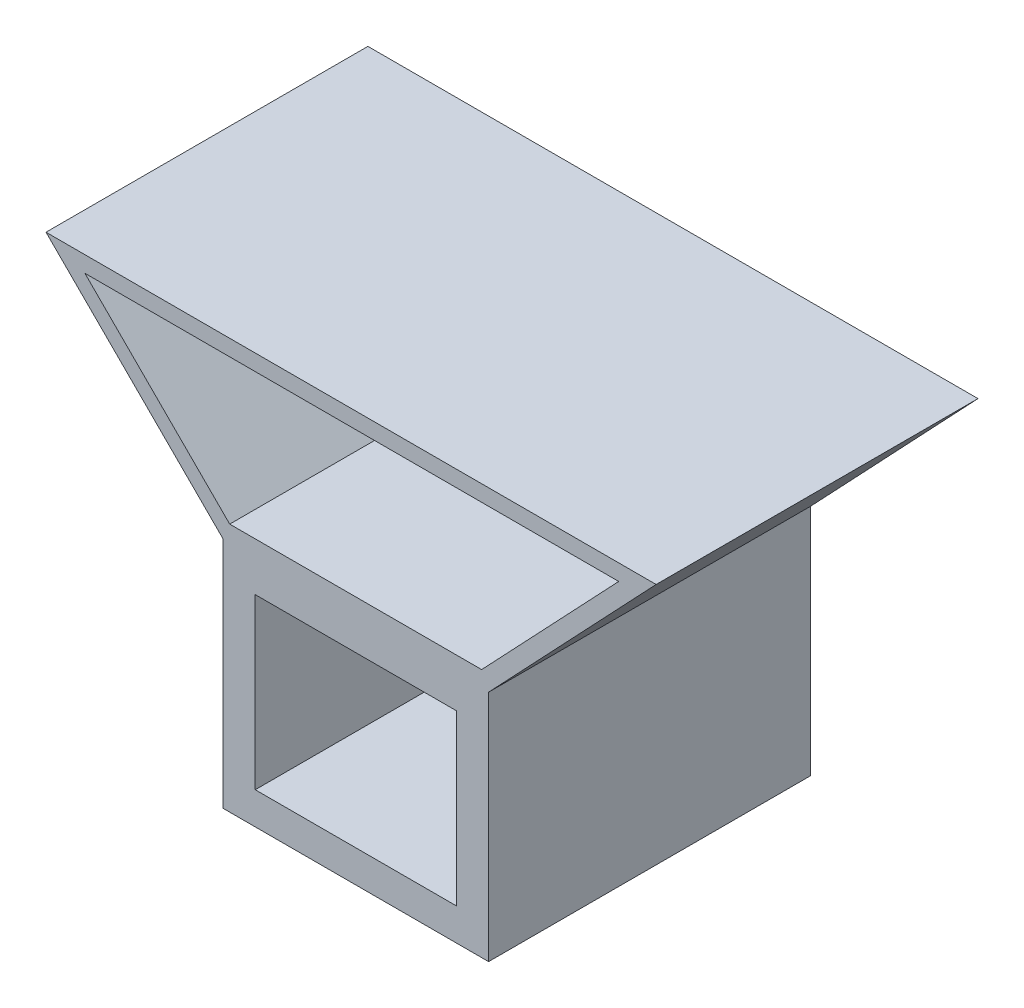
ISO-10303-21;
HEADER;
FILE_DESCRIPTION(('STEP AP214'),'2;1');
FILE_NAME('part.step','',(''),(''),'','','');
FILE_SCHEMA(('AUTOMOTIVE_DESIGN { 1 0 10303 214 1 1 1 1 }'));
ENDSEC;
DATA;
#1=APPLICATION_CONTEXT('core data for automotive mechanical design processes');
#2=APPLICATION_PROTOCOL_DEFINITION('international standard','automotive_design',2000,#1);
#3=PRODUCT_CONTEXT('',#1,'mechanical');
#4=PRODUCT('Part','Part','',(#3));
#5=PRODUCT_RELATED_PRODUCT_CATEGORY('part','',(#4));
#6=PRODUCT_DEFINITION_FORMATION('','',#4);
#7=PRODUCT_DEFINITION_CONTEXT('part definition',#1,'design');
#8=PRODUCT_DEFINITION('design','',#6,#7);
#9=PRODUCT_DEFINITION_SHAPE('','',#8);
#10=(LENGTH_UNIT() NAMED_UNIT(*) SI_UNIT(.MILLI.,.METRE.));
#11=(NAMED_UNIT(*) PLANE_ANGLE_UNIT() SI_UNIT($,.RADIAN.));
#12=(NAMED_UNIT(*) SI_UNIT($,.STERADIAN.) SOLID_ANGLE_UNIT());
#13=UNCERTAINTY_MEASURE_WITH_UNIT(LENGTH_MEASURE(1.E-05),#10,'distance_accuracy_value','');
#14=(GEOMETRIC_REPRESENTATION_CONTEXT(3) GLOBAL_UNCERTAINTY_ASSIGNED_CONTEXT((#13)) GLOBAL_UNIT_ASSIGNED_CONTEXT((#10,
#11,#12)) REPRESENTATION_CONTEXT('',''));
#15=CARTESIAN_POINT('',(0.,0.,0.));
#16=DIRECTION('',(0.,0.,1.));
#17=DIRECTION('',(1.,0.,0.));
#18=AXIS2_PLACEMENT_3D('',#15,#16,#17);
#19=CARTESIAN_POINT('',(0.,0.,20.));
#20=DIRECTION('',(0.,0.,1.));
#21=DIRECTION('',(1.,0.,0.));
#22=AXIS2_PLACEMENT_3D('',#19,#20,#21);
#23=PLANE('',#22);
#24=DIRECTION('',(1.,0.,0.));
#25=VECTOR('',#24,1.);
#26=CARTESIAN_POINT('',(-2.,-2.,20.));
#27=LINE('',#26,#25);
#28=CARTESIAN_POINT('',(-2.,-2.,20.));
#29=VERTEX_POINT('',#28);
#30=CARTESIAN_POINT('',(14.5,-2.,20.));
#31=VERTEX_POINT('',#30);
#32=EDGE_CURVE('E264',#29,#31,#27,.T.);
#33=ORIENTED_EDGE('',*,*,#32,.T.);
#34=DIRECTION('',(0.,1.,0.));
#35=VECTOR('',#34,1.);
#36=CARTESIAN_POINT('',(14.5,-2.,20.));
#37=LINE('',#36,#35);
#38=CARTESIAN_POINT('',(14.5,12.5,20.));
#39=VERTEX_POINT('',#38);
#40=EDGE_CURVE('E268',#31,#39,#37,.T.);
#41=ORIENTED_EDGE('',*,*,#40,.T.);
#42=DIRECTION('',(-0.687287569698679,-0.726385432492753,0.));
#43=VECTOR('',#42,1.);
#44=CARTESIAN_POINT('',(24.9079224727031,23.5,20.));
#45=LINE('',#44,#43);
#46=CARTESIAN_POINT('',(24.9079224727031,23.5,20.));
#47=VERTEX_POINT('',#46);
#48=EDGE_CURVE('E206',#47,#39,#45,.T.);
#49=ORIENTED_EDGE('',*,*,#48,.F.);
#50=DIRECTION('',(1.,0.,0.));
#51=VECTOR('',#50,1.);
#52=CARTESIAN_POINT('',(24.9079224727031,23.5,20.));
#53=LINE('',#52,#51);
#54=CARTESIAN_POINT('',(-13.,23.5,20.));
#55=VERTEX_POINT('',#54);
#56=EDGE_CURVE('E201',#55,#47,#53,.T.);
#57=ORIENTED_EDGE('',*,*,#56,.F.);
#58=DIRECTION('',(-0.707106781186549,0.707106781186546,0.));
#59=VECTOR('',#58,1.);
#60=CARTESIAN_POINT('',(-2.,12.5,20.));
#61=LINE('',#60,#59);
#62=CARTESIAN_POINT('',(-2.,12.5,20.));
#63=VERTEX_POINT('',#62);
#64=EDGE_CURVE('E197',#63,#55,#61,.T.);
#65=ORIENTED_EDGE('',*,*,#64,.F.);
#66=DIRECTION('',(0.,-1.,0.));
#67=VECTOR('',#66,1.);
#68=CARTESIAN_POINT('',(-2.,-2.,20.));
#69=LINE('',#68,#67);
#70=EDGE_CURVE('E272',#63,#29,#69,.T.);
#71=ORIENTED_EDGE('',*,*,#70,.T.);
#72=EDGE_LOOP('',(#33,#41,#49,#57,#65,#71));
#73=FACE_BOUND('',#72,.T.);
#74=DIRECTION('',(1.,0.,0.));
#75=VECTOR('',#74,1.);
#76=CARTESIAN_POINT('',(0.,0.,20.));
#77=LINE('',#76,#75);
#78=CARTESIAN_POINT('',(0.,0.,20.));
#79=VERTEX_POINT('',#78);
#80=CARTESIAN_POINT('',(12.5,0.,20.));
#81=VERTEX_POINT('',#80);
#82=EDGE_CURVE('E229',#79,#81,#77,.T.);
#83=ORIENTED_EDGE('',*,*,#82,.F.);
#84=DIRECTION('',(0.,-1.,0.));
#85=VECTOR('',#84,1.);
#86=CARTESIAN_POINT('',(0.,0.,20.));
#87=LINE('',#86,#85);
#88=CARTESIAN_POINT('',(0.,10.5,20.));
#89=VERTEX_POINT('',#88);
#90=EDGE_CURVE('E226',#89,#79,#87,.T.);
#91=ORIENTED_EDGE('',*,*,#90,.F.);
#92=DIRECTION('',(-1.,0.,0.));
#93=VECTOR('',#92,1.);
#94=CARTESIAN_POINT('',(0.,10.5,20.));
#95=LINE('',#94,#93);
#96=CARTESIAN_POINT('',(12.5,10.5,20.));
#97=VERTEX_POINT('',#96);
#98=EDGE_CURVE('E236',#97,#89,#95,.T.);
#99=ORIENTED_EDGE('',*,*,#98,.F.);
#100=DIRECTION('',(0.,1.,0.));
#101=VECTOR('',#100,1.);
#102=CARTESIAN_POINT('',(12.5,0.,20.));
#103=LINE('',#102,#101);
#104=EDGE_CURVE('E233',#81,#97,#103,.T.);
#105=ORIENTED_EDGE('',*,*,#104,.F.);
#106=EDGE_LOOP('',(#83,#91,#99,#105));
#107=FACE_BOUND('',#106,.T.);
#108=DIRECTION('',(1.,0.,0.));
#109=VECTOR('',#108,1.);
#110=CARTESIAN_POINT('',(22.5850681116122,22.5,20.));
#111=LINE('',#110,#109);
#112=CARTESIAN_POINT('',(-10.5857864376269,22.5,20.));
#113=VERTEX_POINT('',#112);
#114=CARTESIAN_POINT('',(22.5850681116122,22.5,20.));
#115=VERTEX_POINT('',#114);
#116=EDGE_CURVE('E147',#113,#115,#111,.T.);
#117=ORIENTED_EDGE('',*,*,#116,.T.);
#118=DIRECTION('',(-0.687287569698679,-0.726385432492752,0.));
#119=VECTOR('',#118,1.);
#120=CARTESIAN_POINT('',(22.5850681116122,22.5,20.));
#121=LINE('',#120,#119);
#122=CARTESIAN_POINT('',(14.0694951794006,13.5,20.));
#123=VERTEX_POINT('',#122);
#124=EDGE_CURVE('E160',#115,#123,#121,.T.);
#125=ORIENTED_EDGE('',*,*,#124,.T.);
#126=DIRECTION('',(-1.,0.,0.));
#127=VECTOR('',#126,1.);
#128=CARTESIAN_POINT('',(14.0694951794006,13.5,20.));
#129=LINE('',#128,#127);
#130=CARTESIAN_POINT('',(-1.58578643762691,13.5,20.));
#131=VERTEX_POINT('',#130);
#132=EDGE_CURVE('E165',#123,#131,#129,.T.);
#133=ORIENTED_EDGE('',*,*,#132,.T.);
#134=DIRECTION('',(-0.707106781186548,0.707106781186547,0.));
#135=VECTOR('',#134,1.);
#136=CARTESIAN_POINT('',(-1.58578643762691,13.5,20.));
#137=LINE('',#136,#135);
#138=EDGE_CURVE('E156',#131,#113,#137,.T.);
#139=ORIENTED_EDGE('',*,*,#138,.T.);
#140=EDGE_LOOP('',(#117,#125,#133,#139));
#141=FACE_BOUND('',#140,.T.);
#142=ADVANCED_FACE('F39',(#73,#107,#141),#23,.T.);
#143=CARTESIAN_POINT('',(0.,0.,0.));
#144=DIRECTION('',(0.,0.,1.));
#145=DIRECTION('',(1.,0.,0.));
#146=AXIS2_PLACEMENT_3D('',#143,#144,#145);
#147=PLANE('',#146);
#148=DIRECTION('',(1.,0.,0.));
#149=VECTOR('',#148,1.);
#150=CARTESIAN_POINT('',(-2.,-2.,0.));
#151=LINE('',#150,#149);
#152=CARTESIAN_POINT('',(-2.,-2.,0.));
#153=VERTEX_POINT('',#152);
#154=CARTESIAN_POINT('',(14.5,-2.,0.));
#155=VERTEX_POINT('',#154);
#156=EDGE_CURVE('E263',#153,#155,#151,.T.);
#157=ORIENTED_EDGE('',*,*,#156,.F.);
#158=DIRECTION('',(0.,-1.,0.));
#159=VECTOR('',#158,1.);
#160=CARTESIAN_POINT('',(-2.,-2.,0.));
#161=LINE('',#160,#159);
#162=CARTESIAN_POINT('',(-2.,12.5,0.));
#163=VERTEX_POINT('',#162);
#164=EDGE_CURVE('E269',#163,#153,#161,.T.);
#165=ORIENTED_EDGE('',*,*,#164,.F.);
#166=DIRECTION('',(-0.707106781186549,0.707106781186546,0.));
#167=VECTOR('',#166,1.);
#168=CARTESIAN_POINT('',(-2.,12.5,0.));
#169=LINE('',#168,#167);
#170=CARTESIAN_POINT('',(-13.,23.5,0.));
#171=VERTEX_POINT('',#170);
#172=EDGE_CURVE('E191',#163,#171,#169,.T.);
#173=ORIENTED_EDGE('',*,*,#172,.T.);
#174=DIRECTION('',(1.,0.,0.));
#175=VECTOR('',#174,1.);
#176=CARTESIAN_POINT('',(24.9079224727031,23.5,0.));
#177=LINE('',#176,#175);
#178=CARTESIAN_POINT('',(24.9079224727031,23.5,0.));
#179=VERTEX_POINT('',#178);
#180=EDGE_CURVE('E214',#171,#179,#177,.T.);
#181=ORIENTED_EDGE('',*,*,#180,.T.);
#182=DIRECTION('',(-0.687287569698679,-0.726385432492753,0.));
#183=VECTOR('',#182,1.);
#184=CARTESIAN_POINT('',(24.9079224727031,23.5,0.));
#185=LINE('',#184,#183);
#186=CARTESIAN_POINT('',(14.5,12.5,0.));
#187=VERTEX_POINT('',#186);
#188=EDGE_CURVE('E202',#179,#187,#185,.T.);
#189=ORIENTED_EDGE('',*,*,#188,.T.);
#190=DIRECTION('',(0.,1.,0.));
#191=VECTOR('',#190,1.);
#192=CARTESIAN_POINT('',(14.5,-2.,0.));
#193=LINE('',#192,#191);
#194=EDGE_CURVE('E279',#155,#187,#193,.T.);
#195=ORIENTED_EDGE('',*,*,#194,.F.);
#196=EDGE_LOOP('',(#157,#165,#173,#181,#189,#195));
#197=FACE_BOUND('',#196,.T.);
#198=DIRECTION('',(0.,-1.,0.));
#199=VECTOR('',#198,1.);
#200=CARTESIAN_POINT('',(0.,0.,0.));
#201=LINE('',#200,#199);
#202=CARTESIAN_POINT('',(0.,10.5,0.));
#203=VERTEX_POINT('',#202);
#204=CARTESIAN_POINT('',(0.,0.,0.));
#205=VERTEX_POINT('',#204);
#206=EDGE_CURVE('E63',#203,#205,#201,.T.);
#207=ORIENTED_EDGE('',*,*,#206,.T.);
#208=DIRECTION('',(1.,0.,0.));
#209=VECTOR('',#208,1.);
#210=CARTESIAN_POINT('',(0.,0.,0.));
#211=LINE('',#210,#209);
#212=CARTESIAN_POINT('',(12.5,0.,0.));
#213=VERTEX_POINT('',#212);
#214=EDGE_CURVE('E242',#205,#213,#211,.T.);
#215=ORIENTED_EDGE('',*,*,#214,.T.);
#216=DIRECTION('',(0.,1.,0.));
#217=VECTOR('',#216,1.);
#218=CARTESIAN_POINT('',(12.5,0.,0.));
#219=LINE('',#218,#217);
#220=CARTESIAN_POINT('',(12.5,10.5,0.));
#221=VERTEX_POINT('',#220);
#222=EDGE_CURVE('E246',#213,#221,#219,.T.);
#223=ORIENTED_EDGE('',*,*,#222,.T.);
#224=DIRECTION('',(-1.,0.,0.));
#225=VECTOR('',#224,1.);
#226=CARTESIAN_POINT('',(0.,10.5,0.));
#227=LINE('',#226,#225);
#228=EDGE_CURVE('E230',#221,#203,#227,.T.);
#229=ORIENTED_EDGE('',*,*,#228,.T.);
#230=EDGE_LOOP('',(#207,#215,#223,#229));
#231=FACE_BOUND('',#230,.T.);
#232=DIRECTION('',(-0.687287569698679,-0.726385432492752,0.));
#233=VECTOR('',#232,1.);
#234=CARTESIAN_POINT('',(22.5850681116122,22.5,0.));
#235=LINE('',#234,#233);
#236=CARTESIAN_POINT('',(22.5850681116122,22.5,0.));
#237=VERTEX_POINT('',#236);
#238=CARTESIAN_POINT('',(14.0694951794006,13.5,0.));
#239=VERTEX_POINT('',#238);
#240=EDGE_CURVE('E182',#237,#239,#235,.T.);
#241=ORIENTED_EDGE('',*,*,#240,.F.);
#242=DIRECTION('',(1.,0.,0.));
#243=VECTOR('',#242,1.);
#244=CARTESIAN_POINT('',(22.5850681116122,22.5,0.));
#245=LINE('',#244,#243);
#246=CARTESIAN_POINT('',(-10.5857864376269,22.5,0.));
#247=VERTEX_POINT('',#246);
#248=EDGE_CURVE('E150',#247,#237,#245,.T.);
#249=ORIENTED_EDGE('',*,*,#248,.F.);
#250=DIRECTION('',(-0.707106781186548,0.707106781186547,0.));
#251=VECTOR('',#250,1.);
#252=CARTESIAN_POINT('',(-1.58578643762691,13.5,0.));
#253=LINE('',#252,#251);
#254=CARTESIAN_POINT('',(-1.58578643762691,13.5,0.));
#255=VERTEX_POINT('',#254);
#256=EDGE_CURVE('E169',#255,#247,#253,.T.);
#257=ORIENTED_EDGE('',*,*,#256,.F.);
#258=DIRECTION('',(-1.,0.,0.));
#259=VECTOR('',#258,1.);
#260=CARTESIAN_POINT('',(14.0694951794006,13.5,0.));
#261=LINE('',#260,#259);
#262=EDGE_CURVE('E173',#239,#255,#261,.T.);
#263=ORIENTED_EDGE('',*,*,#262,.F.);
#264=EDGE_LOOP('',(#241,#249,#257,#263));
#265=FACE_BOUND('',#264,.T.);
#266=ADVANCED_FACE('F299',(#197,#231,#265),#147,.F.);
#267=CARTESIAN_POINT('',(-2.,-2.,20.));
#268=DIRECTION('',(0.,1.,0.));
#269=DIRECTION('',(0.,0.,1.));
#270=AXIS2_PLACEMENT_3D('',#267,#268,#269);
#271=PLANE('',#270);
#272=ORIENTED_EDGE('',*,*,#156,.T.);
#273=DIRECTION('',(0.,0.,-1.));
#274=VECTOR('',#273,1.);
#275=CARTESIAN_POINT('',(14.5,-2.,20.));
#276=LINE('',#275,#274);
#277=EDGE_CURVE('E11',#31,#155,#276,.T.);
#278=ORIENTED_EDGE('',*,*,#277,.F.);
#279=ORIENTED_EDGE('',*,*,#32,.F.);
#280=DIRECTION('',(0.,0.,-1.));
#281=VECTOR('',#280,1.);
#282=CARTESIAN_POINT('',(-2.,-2.,20.));
#283=LINE('',#282,#281);
#284=EDGE_CURVE('E275',#29,#153,#283,.T.);
#285=ORIENTED_EDGE('',*,*,#284,.T.);
#286=EDGE_LOOP('',(#272,#278,#279,#285));
#287=FACE_BOUND('',#286,.T.);
#288=ADVANCED_FACE('F41',(#287),#271,.F.);
#289=CARTESIAN_POINT('',(14.5,-2.,20.));
#290=DIRECTION('',(-1.,0.,0.));
#291=DIRECTION('',(0.,-1.,0.));
#292=AXIS2_PLACEMENT_3D('',#289,#290,#291);
#293=PLANE('',#292);
#294=ORIENTED_EDGE('',*,*,#194,.T.);
#295=DIRECTION('',(0.,0.,-1.));
#296=VECTOR('',#295,1.);
#297=CARTESIAN_POINT('',(14.5,12.5,20.));
#298=LINE('',#297,#296);
#299=EDGE_CURVE('E48',#39,#187,#298,.T.);
#300=ORIENTED_EDGE('',*,*,#299,.F.);
#301=ORIENTED_EDGE('',*,*,#40,.F.);
#302=ORIENTED_EDGE('',*,*,#277,.T.);
#303=EDGE_LOOP('',(#294,#300,#301,#302));
#304=FACE_BOUND('',#303,.T.);
#305=ADVANCED_FACE('F312',(#304),#293,.F.);
#306=CARTESIAN_POINT('',(-2.,-2.,20.));
#307=DIRECTION('',(1.,0.,0.));
#308=DIRECTION('',(0.,1.,0.));
#309=AXIS2_PLACEMENT_3D('',#306,#307,#308);
#310=PLANE('',#309);
#311=ORIENTED_EDGE('',*,*,#164,.T.);
#312=ORIENTED_EDGE('',*,*,#284,.F.);
#313=ORIENTED_EDGE('',*,*,#70,.F.);
#314=DIRECTION('',(0.,0.,-1.));
#315=VECTOR('',#314,1.);
#316=CARTESIAN_POINT('',(-2.,12.5,20.));
#317=LINE('',#316,#315);
#318=EDGE_CURVE('E287',#63,#163,#317,.T.);
#319=ORIENTED_EDGE('',*,*,#318,.T.);
#320=EDGE_LOOP('',(#311,#312,#313,#319));
#321=FACE_BOUND('',#320,.T.);
#322=ADVANCED_FACE('F319',(#321),#310,.F.);
#323=CARTESIAN_POINT('',(0.,0.,20.));
#324=DIRECTION('',(1.,0.,0.));
#325=DIRECTION('',(0.,1.,0.));
#326=AXIS2_PLACEMENT_3D('',#323,#324,#325);
#327=PLANE('',#326);
#328=ORIENTED_EDGE('',*,*,#206,.F.);
#329=DIRECTION('',(0.,0.,-1.));
#330=VECTOR('',#329,1.);
#331=CARTESIAN_POINT('',(0.,10.5,20.));
#332=LINE('',#331,#330);
#333=EDGE_CURVE('E239',#89,#203,#332,.T.);
#334=ORIENTED_EDGE('',*,*,#333,.F.);
#335=ORIENTED_EDGE('',*,*,#90,.T.);
#336=DIRECTION('',(0.,0.,-1.));
#337=VECTOR('',#336,1.);
#338=CARTESIAN_POINT('',(0.,0.,20.));
#339=LINE('',#338,#337);
#340=EDGE_CURVE('E260',#79,#205,#339,.T.);
#341=ORIENTED_EDGE('',*,*,#340,.T.);
#342=EDGE_LOOP('',(#328,#334,#335,#341));
#343=FACE_BOUND('',#342,.T.);
#344=ADVANCED_FACE('F321',(#343),#327,.T.);
#345=CARTESIAN_POINT('',(0.,0.,20.));
#346=DIRECTION('',(0.,1.,0.));
#347=DIRECTION('',(0.,0.,1.));
#348=AXIS2_PLACEMENT_3D('',#345,#346,#347);
#349=PLANE('',#348);
#350=ORIENTED_EDGE('',*,*,#214,.F.);
#351=ORIENTED_EDGE('',*,*,#340,.F.);
#352=ORIENTED_EDGE('',*,*,#82,.T.);
#353=DIRECTION('',(0.,0.,-1.));
#354=VECTOR('',#353,1.);
#355=CARTESIAN_POINT('',(12.5,0.,20.));
#356=LINE('',#355,#354);
#357=EDGE_CURVE('E257',#81,#213,#356,.T.);
#358=ORIENTED_EDGE('',*,*,#357,.T.);
#359=EDGE_LOOP('',(#350,#351,#352,#358));
#360=FACE_BOUND('',#359,.T.);
#361=ADVANCED_FACE('F327',(#360),#349,.T.);
#362=CARTESIAN_POINT('',(12.5,0.,20.));
#363=DIRECTION('',(-1.,0.,0.));
#364=DIRECTION('',(0.,-1.,0.));
#365=AXIS2_PLACEMENT_3D('',#362,#363,#364);
#366=PLANE('',#365);
#367=ORIENTED_EDGE('',*,*,#222,.F.);
#368=ORIENTED_EDGE('',*,*,#357,.F.);
#369=ORIENTED_EDGE('',*,*,#104,.T.);
#370=DIRECTION('',(0.,0.,-1.));
#371=VECTOR('',#370,1.);
#372=CARTESIAN_POINT('',(12.5,10.5,20.));
#373=LINE('',#372,#371);
#374=EDGE_CURVE('E55',#97,#221,#373,.T.);
#375=ORIENTED_EDGE('',*,*,#374,.T.);
#376=EDGE_LOOP('',(#367,#368,#369,#375));
#377=FACE_BOUND('',#376,.T.);
#378=ADVANCED_FACE('F338',(#377),#366,.T.);
#379=CARTESIAN_POINT('',(0.,10.5,20.));
#380=DIRECTION('',(0.,-1.,0.));
#381=DIRECTION('',(0.,0.,-1.));
#382=AXIS2_PLACEMENT_3D('',#379,#380,#381);
#383=PLANE('',#382);
#384=ORIENTED_EDGE('',*,*,#228,.F.);
#385=ORIENTED_EDGE('',*,*,#374,.F.);
#386=ORIENTED_EDGE('',*,*,#98,.T.);
#387=ORIENTED_EDGE('',*,*,#333,.T.);
#388=EDGE_LOOP('',(#384,#385,#386,#387));
#389=FACE_BOUND('',#388,.T.);
#390=ADVANCED_FACE('F342',(#389),#383,.T.);
#391=CARTESIAN_POINT('',(24.9079224727031,23.5,20.));
#392=DIRECTION('',(0.726385432492753,-0.687287569698679,0.));
#393=DIRECTION('',(0.687287569698679,0.726385432492753,0.));
#394=AXIS2_PLACEMENT_3D('',#391,#392,#393);
#395=PLANE('',#394);
#396=ORIENTED_EDGE('',*,*,#188,.F.);
#397=DIRECTION('',(0.,0.,-1.));
#398=VECTOR('',#397,1.);
#399=CARTESIAN_POINT('',(24.9079224727031,23.5,20.));
#400=LINE('',#399,#398);
#401=EDGE_CURVE('E221',#47,#179,#400,.T.);
#402=ORIENTED_EDGE('',*,*,#401,.F.);
#403=ORIENTED_EDGE('',*,*,#48,.T.);
#404=ORIENTED_EDGE('',*,*,#299,.T.);
#405=EDGE_LOOP('',(#396,#402,#403,#404));
#406=FACE_BOUND('',#405,.T.);
#407=ADVANCED_FACE('F294',(#406),#395,.T.);
#408=CARTESIAN_POINT('',(24.9079224727031,23.5,20.));
#409=DIRECTION('',(0.,1.,0.));
#410=DIRECTION('',(0.,0.,1.));
#411=AXIS2_PLACEMENT_3D('',#408,#409,#410);
#412=PLANE('',#411);
#413=ORIENTED_EDGE('',*,*,#180,.F.);
#414=DIRECTION('',(0.,0.,-1.));
#415=VECTOR('',#414,1.);
#416=CARTESIAN_POINT('',(-13.,23.5,20.));
#417=LINE('',#416,#415);
#418=EDGE_CURVE('E210',#55,#171,#417,.T.);
#419=ORIENTED_EDGE('',*,*,#418,.F.);
#420=ORIENTED_EDGE('',*,*,#56,.T.);
#421=ORIENTED_EDGE('',*,*,#401,.T.);
#422=EDGE_LOOP('',(#413,#419,#420,#421));
#423=FACE_BOUND('',#422,.T.);
#424=ADVANCED_FACE('F305',(#423),#412,.T.);
#425=CARTESIAN_POINT('',(-2.,12.5,20.));
#426=DIRECTION('',(-0.707106781186546,-0.707106781186549,0.));
#427=DIRECTION('',(0.707106781186549,-0.707106781186546,0.));
#428=AXIS2_PLACEMENT_3D('',#425,#426,#427);
#429=PLANE('',#428);
#430=ORIENTED_EDGE('',*,*,#172,.F.);
#431=ORIENTED_EDGE('',*,*,#318,.F.);
#432=ORIENTED_EDGE('',*,*,#64,.T.);
#433=ORIENTED_EDGE('',*,*,#418,.T.);
#434=EDGE_LOOP('',(#430,#431,#432,#433));
#435=FACE_BOUND('',#434,.T.);
#436=ADVANCED_FACE('F318',(#435),#429,.T.);
#437=CARTESIAN_POINT('',(22.5850681116122,22.5,20.));
#438=DIRECTION('',(0.,1.,0.));
#439=DIRECTION('',(0.,0.,1.));
#440=AXIS2_PLACEMENT_3D('',#437,#438,#439);
#441=PLANE('',#440);
#442=ORIENTED_EDGE('',*,*,#248,.T.);
#443=DIRECTION('',(0.,0.,-1.));
#444=VECTOR('',#443,1.);
#445=CARTESIAN_POINT('',(22.5850681116122,22.5,20.));
#446=LINE('',#445,#444);
#447=EDGE_CURVE('E143',#115,#237,#446,.T.);
#448=ORIENTED_EDGE('',*,*,#447,.F.);
#449=ORIENTED_EDGE('',*,*,#116,.F.);
#450=DIRECTION('',(0.,0.,-1.));
#451=VECTOR('',#450,1.);
#452=CARTESIAN_POINT('',(-10.5857864376269,22.5,20.));
#453=LINE('',#452,#451);
#454=EDGE_CURVE('E188',#113,#247,#453,.T.);
#455=ORIENTED_EDGE('',*,*,#454,.T.);
#456=EDGE_LOOP('',(#442,#448,#449,#455));
#457=FACE_BOUND('',#456,.T.);
#458=ADVANCED_FACE('F145',(#457),#441,.F.);
#459=CARTESIAN_POINT('',(-1.58578643762691,13.5,20.));
#460=DIRECTION('',(-0.707106781186547,-0.707106781186548,0.));
#461=DIRECTION('',(0.707106781186548,-0.707106781186547,0.));
#462=AXIS2_PLACEMENT_3D('',#459,#460,#461);
#463=PLANE('',#462);
#464=ORIENTED_EDGE('',*,*,#256,.T.);
#465=ORIENTED_EDGE('',*,*,#454,.F.);
#466=ORIENTED_EDGE('',*,*,#138,.F.);
#467=DIRECTION('',(0.,0.,-1.));
#468=VECTOR('',#467,1.);
#469=CARTESIAN_POINT('',(-1.58578643762691,13.5,20.));
#470=LINE('',#469,#468);
#471=EDGE_CURVE('E192',#131,#255,#470,.T.);
#472=ORIENTED_EDGE('',*,*,#471,.T.);
#473=EDGE_LOOP('',(#464,#465,#466,#472));
#474=FACE_BOUND('',#473,.T.);
#475=ADVANCED_FACE('F354',(#474),#463,.F.);
#476=CARTESIAN_POINT('',(14.0694951794006,13.5,20.));
#477=DIRECTION('',(0.,-1.,0.));
#478=DIRECTION('',(0.,0.,-1.));
#479=AXIS2_PLACEMENT_3D('',#476,#477,#478);
#480=PLANE('',#479);
#481=ORIENTED_EDGE('',*,*,#262,.T.);
#482=ORIENTED_EDGE('',*,*,#471,.F.);
#483=ORIENTED_EDGE('',*,*,#132,.F.);
#484=DIRECTION('',(0.,0.,-1.));
#485=VECTOR('',#484,1.);
#486=CARTESIAN_POINT('',(14.0694951794006,13.5,20.));
#487=LINE('',#486,#485);
#488=EDGE_CURVE('E155',#123,#239,#487,.T.);
#489=ORIENTED_EDGE('',*,*,#488,.T.);
#490=EDGE_LOOP('',(#481,#482,#483,#489));
#491=FACE_BOUND('',#490,.T.);
#492=ADVANCED_FACE('F357',(#491),#480,.F.);
#493=CARTESIAN_POINT('',(22.5850681116122,22.5,20.));
#494=DIRECTION('',(0.726385432492752,-0.687287569698679,0.));
#495=DIRECTION('',(0.687287569698679,0.726385432492753,0.));
#496=AXIS2_PLACEMENT_3D('',#493,#494,#495);
#497=PLANE('',#496);
#498=ORIENTED_EDGE('',*,*,#240,.T.);
#499=ORIENTED_EDGE('',*,*,#488,.F.);
#500=ORIENTED_EDGE('',*,*,#124,.F.);
#501=ORIENTED_EDGE('',*,*,#447,.T.);
#502=EDGE_LOOP('',(#498,#499,#500,#501));
#503=FACE_BOUND('',#502,.T.);
#504=ADVANCED_FACE('F161',(#503),#497,.F.);
#505=CLOSED_SHELL('',(#142,#266,#288,#305,#322,#344,#361,#378,#390,#407,#424,#436,#458,#475,
#492,#504));
#506=MANIFOLD_SOLID_BREP('B2',#505);
#507=ADVANCED_BREP_SHAPE_REPRESENTATION('',(#18,#506),#14);
#508=SHAPE_DEFINITION_REPRESENTATION(#9,#507);
ENDSEC;
END-ISO-10303-21;
